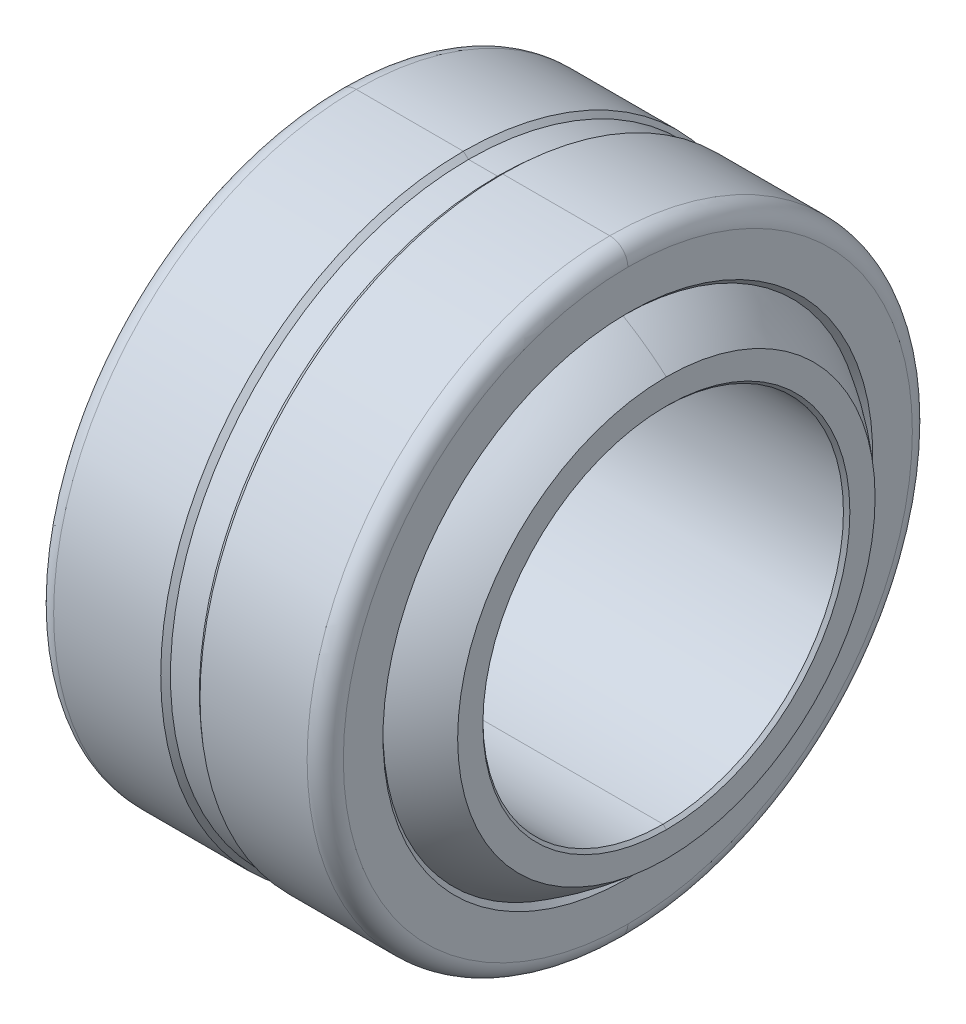
ISO-10303-21;
HEADER;
FILE_DESCRIPTION(('STEP AP214'),'2;1');
FILE_NAME('part.step','',(''),(''),'','','');
FILE_SCHEMA(('AUTOMOTIVE_DESIGN { 1 0 10303 214 1 1 1 1 }'));
ENDSEC;
DATA;
#1=APPLICATION_CONTEXT('core data for automotive mechanical design processes');
#2=APPLICATION_PROTOCOL_DEFINITION('international standard','automotive_design',2000,#1);
#3=PRODUCT_CONTEXT('',#1,'mechanical');
#4=PRODUCT('Part','Part','',(#3));
#5=PRODUCT_RELATED_PRODUCT_CATEGORY('part','',(#4));
#6=PRODUCT_DEFINITION_FORMATION('','',#4);
#7=PRODUCT_DEFINITION_CONTEXT('part definition',#1,'design');
#8=PRODUCT_DEFINITION('design','',#6,#7);
#9=PRODUCT_DEFINITION_SHAPE('','',#8);
#10=(LENGTH_UNIT() NAMED_UNIT(*) SI_UNIT(.MILLI.,.METRE.));
#11=(NAMED_UNIT(*) PLANE_ANGLE_UNIT() SI_UNIT($,.RADIAN.));
#12=(NAMED_UNIT(*) SI_UNIT($,.STERADIAN.) SOLID_ANGLE_UNIT());
#13=UNCERTAINTY_MEASURE_WITH_UNIT(LENGTH_MEASURE(1.E-05),#10,'distance_accuracy_value','');
#14=(GEOMETRIC_REPRESENTATION_CONTEXT(3) GLOBAL_UNCERTAINTY_ASSIGNED_CONTEXT((#13)) GLOBAL_UNIT_ASSIGNED_CONTEXT((#10,
#11,#12)) REPRESENTATION_CONTEXT('',''));
#15=CARTESIAN_POINT('',(0.,0.,0.));
#16=DIRECTION('',(0.,0.,1.));
#17=DIRECTION('',(1.,0.,0.));
#18=AXIS2_PLACEMENT_3D('',#15,#16,#17);
#19=CARTESIAN_POINT('',(-45.212,0.,0.));
#20=DIRECTION('',(1.,0.,0.));
#21=DIRECTION('',(0.,-1.,0.));
#22=AXIS2_PLACEMENT_3D('',#19,#20,#21);
#23=PLANE('',#22);
#24=CARTESIAN_POINT('',(-45.212,0.,0.));
#25=DIRECTION('',(-1.,0.,0.));
#26=DIRECTION('',(0.,1.,0.));
#27=AXIS2_PLACEMENT_3D('',#24,#25,#26);
#28=CIRCLE('',#27,45.2413850706692);
#29=CARTESIAN_POINT('',(-45.212,45.2413850706692,0.));
#30=VERTEX_POINT('',#29);
#31=CARTESIAN_POINT('',(-45.212,-45.2413850706692,0.));
#32=VERTEX_POINT('',#31);
#33=EDGE_CURVE('E25',#30,#32,#28,.T.);
#34=ORIENTED_EDGE('',*,*,#33,.F.);
#35=CARTESIAN_POINT('',(-45.212,0.,0.));
#36=DIRECTION('',(1.,0.,0.));
#37=DIRECTION('',(0.,1.,0.));
#38=AXIS2_PLACEMENT_3D('',#35,#36,#37);
#39=CIRCLE('',#38,45.2413850706692);
#40=EDGE_CURVE('E10',#30,#32,#39,.T.);
#41=ORIENTED_EDGE('',*,*,#40,.T.);
#42=EDGE_LOOP('',(#34,#41));
#43=FACE_BOUND('',#42,.T.);
#44=CARTESIAN_POINT('',(-45.212,0.,0.));
#45=DIRECTION('',(1.,0.,0.));
#46=DIRECTION('',(0.,1.,0.));
#47=AXIS2_PLACEMENT_3D('',#44,#45,#46);
#48=CIRCLE('',#47,51.4649946122605);
#49=CARTESIAN_POINT('',(-45.212,51.4649946122605,0.));
#50=VERTEX_POINT('',#49);
#51=CARTESIAN_POINT('',(-45.212,-51.4649946122605,0.));
#52=VERTEX_POINT('',#51);
#53=EDGE_CURVE('E19',#50,#52,#48,.T.);
#54=ORIENTED_EDGE('',*,*,#53,.F.);
#55=CARTESIAN_POINT('',(-45.212,0.,0.));
#56=DIRECTION('',(-1.,0.,0.));
#57=DIRECTION('',(0.,1.,0.));
#58=AXIS2_PLACEMENT_3D('',#55,#56,#57);
#59=CIRCLE('',#58,51.4649946122605);
#60=EDGE_CURVE('E247',#50,#52,#59,.T.);
#61=ORIENTED_EDGE('',*,*,#60,.T.);
#62=EDGE_LOOP('',(#54,#61));
#63=FACE_BOUND('',#62,.T.);
#64=ADVANCED_FACE('F16',(#43,#63),#23,.F.);
#65=CARTESIAN_POINT('',(-44.2257992607137,0.,0.));
#66=DIRECTION('',(-1.,0.,0.));
#67=DIRECTION('',(0.,1.,0.));
#68=AXIS2_PLACEMENT_3D('',#65,#66,#67);
#69=CONICAL_SURFACE('',#68,44.2551843313829,0.785398163397445);
#70=CARTESIAN_POINT('',(-44.4206149293308,0.,0.));
#71=DIRECTION('',(1.,0.,0.));
#72=DIRECTION('',(0.,1.,0.));
#73=AXIS2_PLACEMENT_3D('',#70,#71,#72);
#74=CIRCLE('',#73,44.45);
#75=CARTESIAN_POINT('',(-44.4206149293308,44.45,0.));
#76=VERTEX_POINT('',#75);
#77=CARTESIAN_POINT('',(-44.4206149293308,-44.45,0.));
#78=VERTEX_POINT('',#77);
#79=EDGE_CURVE('E225',#76,#78,#74,.T.);
#80=ORIENTED_EDGE('',*,*,#79,.T.);
#81=DIRECTION('',(0.707106781186551,0.707106781186544,0.));
#82=VECTOR('',#81,1.);
#83=CARTESIAN_POINT('',(-45.212,-45.2413850706692,0.));
#84=LINE('',#83,#82);
#85=EDGE_CURVE('E241',#32,#78,#84,.T.);
#86=ORIENTED_EDGE('',*,*,#85,.F.);
#87=ORIENTED_EDGE('',*,*,#40,.F.);
#88=DIRECTION('',(0.707106781186551,-0.707106781186544,0.));
#89=VECTOR('',#88,1.);
#90=CARTESIAN_POINT('',(-45.212,45.2413850706692,0.));
#91=LINE('',#90,#89);
#92=EDGE_CURVE('E238',#30,#76,#91,.T.);
#93=ORIENTED_EDGE('',*,*,#92,.T.);
#94=EDGE_LOOP('',(#80,#86,#87,#93));
#95=FACE_BOUND('',#94,.T.);
#96=ADVANCED_FACE('F426',(#95),#69,.F.);
#97=CARTESIAN_POINT('',(-44.2257992607137,0.,0.));
#98=DIRECTION('',(-1.,0.,0.));
#99=DIRECTION('',(0.,1.,0.));
#100=AXIS2_PLACEMENT_3D('',#97,#98,#99);
#101=CONICAL_SURFACE('',#100,44.2551843313829,0.785398163397445);
#102=ORIENTED_EDGE('',*,*,#33,.T.);
#103=ORIENTED_EDGE('',*,*,#85,.T.);
#104=CARTESIAN_POINT('',(-44.4206149293308,0.,0.));
#105=DIRECTION('',(-1.,0.,0.));
#106=DIRECTION('',(0.,1.,0.));
#107=AXIS2_PLACEMENT_3D('',#104,#105,#106);
#108=CIRCLE('',#107,44.45);
#109=EDGE_CURVE('E234',#76,#78,#108,.T.);
#110=ORIENTED_EDGE('',*,*,#109,.F.);
#111=ORIENTED_EDGE('',*,*,#92,.F.);
#112=EDGE_LOOP('',(#102,#103,#110,#111));
#113=FACE_BOUND('',#112,.T.);
#114=ADVANCED_FACE('F431',(#113),#101,.F.);
#115=CARTESIAN_POINT('',(-49.7332,0.,0.));
#116=DIRECTION('',(1.,0.,0.));
#117=DIRECTION('',(0.,-1.,0.));
#118=AXIS2_PLACEMENT_3D('',#115,#116,#117);
#119=CYLINDRICAL_SURFACE('',#118,44.45);
#120=ORIENTED_EDGE('',*,*,#109,.T.);
#121=DIRECTION('',(1.,0.,0.));
#122=VECTOR('',#121,1.);
#123=CARTESIAN_POINT('',(-44.4206149293308,-44.45,0.));
#124=LINE('',#123,#122);
#125=CARTESIAN_POINT('',(44.4206149293308,-44.45,0.));
#126=VERTEX_POINT('',#125);
#127=EDGE_CURVE('E228',#78,#126,#124,.T.);
#128=ORIENTED_EDGE('',*,*,#127,.T.);
#129=CARTESIAN_POINT('',(44.4206149293308,0.,0.));
#130=DIRECTION('',(-1.,0.,0.));
#131=DIRECTION('',(0.,1.,0.));
#132=AXIS2_PLACEMENT_3D('',#129,#130,#131);
#133=CIRCLE('',#132,44.45);
#134=CARTESIAN_POINT('',(44.4206149293308,44.45,0.));
#135=VERTEX_POINT('',#134);
#136=EDGE_CURVE('E216',#135,#126,#133,.T.);
#137=ORIENTED_EDGE('',*,*,#136,.F.);
#138=DIRECTION('',(1.,0.,0.));
#139=VECTOR('',#138,1.);
#140=CARTESIAN_POINT('',(-44.4206149293308,44.45,0.));
#141=LINE('',#140,#139);
#142=EDGE_CURVE('E224',#76,#135,#141,.T.);
#143=ORIENTED_EDGE('',*,*,#142,.F.);
#144=EDGE_LOOP('',(#120,#128,#137,#143));
#145=FACE_BOUND('',#144,.T.);
#146=ADVANCED_FACE('F667',(#145),#119,.F.);
#147=CARTESIAN_POINT('',(-49.7332,0.,0.));
#148=DIRECTION('',(1.,0.,0.));
#149=DIRECTION('',(0.,-1.,0.));
#150=AXIS2_PLACEMENT_3D('',#147,#148,#149);
#151=CYLINDRICAL_SURFACE('',#150,44.45);
#152=CARTESIAN_POINT('',(44.4206149293308,0.,0.));
#153=DIRECTION('',(1.,0.,0.));
#154=DIRECTION('',(0.,1.,0.));
#155=AXIS2_PLACEMENT_3D('',#152,#153,#154);
#156=CIRCLE('',#155,44.45);
#157=EDGE_CURVE('E220',#135,#126,#156,.T.);
#158=ORIENTED_EDGE('',*,*,#157,.T.);
#159=ORIENTED_EDGE('',*,*,#127,.F.);
#160=ORIENTED_EDGE('',*,*,#79,.F.);
#161=ORIENTED_EDGE('',*,*,#142,.T.);
#162=EDGE_LOOP('',(#158,#159,#160,#161));
#163=FACE_BOUND('',#162,.T.);
#164=ADVANCED_FACE('F658',(#163),#151,.F.);
#165=CARTESIAN_POINT('',(44.2257992607137,0.,0.));
#166=DIRECTION('',(1.,0.,0.));
#167=DIRECTION('',(0.,-1.,0.));
#168=AXIS2_PLACEMENT_3D('',#165,#166,#167);
#169=CONICAL_SURFACE('',#168,44.2551843313829,0.785398163397431);
#170=CARTESIAN_POINT('',(45.212,0.,0.));
#171=DIRECTION('',(1.,0.,0.));
#172=DIRECTION('',(0.,1.,0.));
#173=AXIS2_PLACEMENT_3D('',#170,#171,#172);
#174=CIRCLE('',#173,45.2413850706692);
#175=CARTESIAN_POINT('',(45.212,45.2413850706692,0.));
#176=VERTEX_POINT('',#175);
#177=CARTESIAN_POINT('',(45.212,-45.2413850706692,0.));
#178=VERTEX_POINT('',#177);
#179=EDGE_CURVE('E206',#176,#178,#174,.T.);
#180=ORIENTED_EDGE('',*,*,#179,.T.);
#181=DIRECTION('',(0.70710678118656,-0.707106781186535,0.));
#182=VECTOR('',#181,1.);
#183=CARTESIAN_POINT('',(44.4206149293308,-44.45,0.));
#184=LINE('',#183,#182);
#185=EDGE_CURVE('E212',#126,#178,#184,.T.);
#186=ORIENTED_EDGE('',*,*,#185,.F.);
#187=ORIENTED_EDGE('',*,*,#157,.F.);
#188=DIRECTION('',(0.70710678118656,0.707106781186535,0.));
#189=VECTOR('',#188,1.);
#190=CARTESIAN_POINT('',(44.4206149293308,44.45,0.));
#191=LINE('',#190,#189);
#192=EDGE_CURVE('E209',#135,#176,#191,.T.);
#193=ORIENTED_EDGE('',*,*,#192,.T.);
#194=EDGE_LOOP('',(#180,#186,#187,#193));
#195=FACE_BOUND('',#194,.T.);
#196=ADVANCED_FACE('F649',(#195),#169,.F.);
#197=CARTESIAN_POINT('',(44.2257992607137,0.,0.));
#198=DIRECTION('',(1.,0.,0.));
#199=DIRECTION('',(0.,-1.,0.));
#200=AXIS2_PLACEMENT_3D('',#197,#198,#199);
#201=CONICAL_SURFACE('',#200,44.2551843313829,0.785398163397431);
#202=ORIENTED_EDGE('',*,*,#136,.T.);
#203=ORIENTED_EDGE('',*,*,#185,.T.);
#204=CARTESIAN_POINT('',(45.212,0.,0.));
#205=DIRECTION('',(-1.,0.,0.));
#206=DIRECTION('',(0.,1.,0.));
#207=AXIS2_PLACEMENT_3D('',#204,#205,#206);
#208=CIRCLE('',#207,45.2413850706692);
#209=EDGE_CURVE('E200',#176,#178,#208,.T.);
#210=ORIENTED_EDGE('',*,*,#209,.F.);
#211=ORIENTED_EDGE('',*,*,#192,.F.);
#212=EDGE_LOOP('',(#202,#203,#210,#211));
#213=FACE_BOUND('',#212,.T.);
#214=ADVANCED_FACE('F640',(#213),#201,.F.);
#215=CARTESIAN_POINT('',(45.212,0.,0.));
#216=DIRECTION('',(1.,0.,0.));
#217=DIRECTION('',(0.,-1.,0.));
#218=AXIS2_PLACEMENT_3D('',#215,#216,#217);
#219=PLANE('',#218);
#220=ORIENTED_EDGE('',*,*,#179,.F.);
#221=ORIENTED_EDGE('',*,*,#209,.T.);
#222=EDGE_LOOP('',(#220,#221));
#223=FACE_BOUND('',#222,.T.);
#224=CARTESIAN_POINT('',(45.212,0.,0.));
#225=DIRECTION('',(-1.,0.,0.));
#226=DIRECTION('',(0.,1.,0.));
#227=AXIS2_PLACEMENT_3D('',#224,#225,#226);
#228=CIRCLE('',#227,51.4649946122605);
#229=CARTESIAN_POINT('',(45.212,51.4649946122605,0.));
#230=VERTEX_POINT('',#229);
#231=CARTESIAN_POINT('',(45.212,-51.4649946122605,0.));
#232=VERTEX_POINT('',#231);
#233=EDGE_CURVE('E190',#230,#232,#228,.T.);
#234=ORIENTED_EDGE('',*,*,#233,.F.);
#235=CARTESIAN_POINT('',(45.212,0.,0.));
#236=DIRECTION('',(1.,0.,0.));
#237=DIRECTION('',(0.,1.,0.));
#238=AXIS2_PLACEMENT_3D('',#235,#236,#237);
#239=CIRCLE('',#238,51.4649946122605);
#240=EDGE_CURVE('E197',#230,#232,#239,.T.);
#241=ORIENTED_EDGE('',*,*,#240,.T.);
#242=EDGE_LOOP('',(#234,#241));
#243=FACE_BOUND('',#242,.T.);
#244=ADVANCED_FACE('F632',(#223,#243),#219,.T.);
#245=CARTESIAN_POINT('',(34.3191617735336,0.,0.));
#246=DIRECTION('',(1.,0.,0.));
#247=DIRECTION('',(0.,-1.,0.));
#248=AXIS2_PLACEMENT_3D('',#245,#246,#247);
#249=CONICAL_SURFACE('',#248,58.9791310948253,0.785398163397491);
#250=DIRECTION('',(0.707106781186517,0.707106781186578,0.));
#251=VECTOR('',#250,1.);
#252=CARTESIAN_POINT('',(34.5139774421507,59.1739467634424,0.));
#253=LINE('',#252,#251);
#254=CARTESIAN_POINT('',(34.5139774421507,59.1739467634424,0.));
#255=VERTEX_POINT('',#254);
#256=CARTESIAN_POINT('',(35.7124,60.3723693212918,0.));
#257=VERTEX_POINT('',#256);
#258=EDGE_CURVE('E181',#255,#257,#253,.T.);
#259=ORIENTED_EDGE('',*,*,#258,.T.);
#260=CARTESIAN_POINT('',(35.7124,0.,0.));
#261=DIRECTION('',(1.,0.,0.));
#262=DIRECTION('',(0.,1.,0.));
#263=AXIS2_PLACEMENT_3D('',#260,#261,#262);
#264=CIRCLE('',#263,60.3723693212918);
#265=CARTESIAN_POINT('',(35.7124,-60.3723693212918,0.));
#266=VERTEX_POINT('',#265);
#267=EDGE_CURVE('E174',#257,#266,#264,.T.);
#268=ORIENTED_EDGE('',*,*,#267,.T.);
#269=DIRECTION('',(0.707106781186517,-0.707106781186578,0.));
#270=VECTOR('',#269,1.);
#271=CARTESIAN_POINT('',(34.5139774421507,-59.1739467634424,0.));
#272=LINE('',#271,#270);
#273=CARTESIAN_POINT('',(34.5139774421507,-59.1739467634424,0.));
#274=VERTEX_POINT('',#273);
#275=EDGE_CURVE('E33',#274,#266,#272,.T.);
#276=ORIENTED_EDGE('',*,*,#275,.F.);
#277=CARTESIAN_POINT('',(34.5139774421507,0.,0.));
#278=DIRECTION('',(1.,0.,0.));
#279=DIRECTION('',(0.,1.,0.));
#280=AXIS2_PLACEMENT_3D('',#277,#278,#279);
#281=CIRCLE('',#280,59.1739467634424);
#282=EDGE_CURVE('E37',#255,#274,#281,.T.);
#283=ORIENTED_EDGE('',*,*,#282,.F.);
#284=EDGE_LOOP('',(#259,#268,#276,#283));
#285=FACE_BOUND('',#284,.T.);
#286=ADVANCED_FACE('F623',(#285),#249,.F.);
#287=CARTESIAN_POINT('',(0.,0.,0.));
#288=DIRECTION('',(1.,0.,0.));
#289=DIRECTION('',(0.,-1.,0.));
#290=AXIS2_PLACEMENT_3D('',#287,#288,#289);
#291=SPHERICAL_SURFACE('',#290,68.5038);
#292=CARTESIAN_POINT('',(0.,0.,0.));
#293=DIRECTION('',(0.,0.,-1.));
#294=DIRECTION('',(0.659992584352985,-0.751272113550788,0.));
#295=AXIS2_PLACEMENT_3D('',#292,#293,#294);
#296=CIRCLE('',#295,68.5038);
#297=EDGE_CURVE('E186',#232,#274,#296,.T.);
#298=ORIENTED_EDGE('',*,*,#297,.F.);
#299=ORIENTED_EDGE('',*,*,#240,.F.);
#300=CARTESIAN_POINT('',(0.,0.,0.));
#301=DIRECTION('',(0.,0.,1.));
#302=DIRECTION('',(0.659992584352985,0.751272113550788,0.));
#303=AXIS2_PLACEMENT_3D('',#300,#301,#302);
#304=CIRCLE('',#303,68.5038);
#305=EDGE_CURVE('E194',#230,#255,#304,.T.);
#306=ORIENTED_EDGE('',*,*,#305,.T.);
#307=ORIENTED_EDGE('',*,*,#282,.T.);
#308=EDGE_LOOP('',(#298,#299,#306,#307));
#309=FACE_BOUND('',#308,.T.);
#310=ADVANCED_FACE('F614',(#309),#291,.T.);
#311=CARTESIAN_POINT('',(0.,0.,0.));
#312=DIRECTION('',(1.,0.,0.));
#313=DIRECTION('',(0.,-1.,0.));
#314=AXIS2_PLACEMENT_3D('',#311,#312,#313);
#315=SPHERICAL_SURFACE('',#314,68.5038);
#316=ORIENTED_EDGE('',*,*,#305,.F.);
#317=ORIENTED_EDGE('',*,*,#233,.T.);
#318=ORIENTED_EDGE('',*,*,#297,.T.);
#319=CARTESIAN_POINT('',(34.5139774421507,0.,0.));
#320=DIRECTION('',(1.,0.,0.));
#321=DIRECTION('',(0.,-1.,0.));
#322=AXIS2_PLACEMENT_3D('',#319,#320,#321);
#323=CIRCLE('',#322,59.1739467634424);
#324=EDGE_CURVE('E177',#274,#255,#323,.T.);
#325=ORIENTED_EDGE('',*,*,#324,.T.);
#326=EDGE_LOOP('',(#316,#317,#318,#325));
#327=FACE_BOUND('',#326,.T.);
#328=ADVANCED_FACE('F605',(#327),#315,.T.);
#329=CARTESIAN_POINT('',(34.3191617735336,0.,0.));
#330=DIRECTION('',(1.,0.,0.));
#331=DIRECTION('',(0.,-1.,0.));
#332=AXIS2_PLACEMENT_3D('',#329,#330,#331);
#333=CONICAL_SURFACE('',#332,58.9791310948253,0.785398163397491);
#334=ORIENTED_EDGE('',*,*,#275,.T.);
#335=CARTESIAN_POINT('',(35.7124,0.,0.));
#336=DIRECTION('',(-1.,0.,0.));
#337=DIRECTION('',(0.,1.,0.));
#338=AXIS2_PLACEMENT_3D('',#335,#336,#337);
#339=CIRCLE('',#338,60.3723693212918);
#340=EDGE_CURVE('E155',#257,#266,#339,.T.);
#341=ORIENTED_EDGE('',*,*,#340,.F.);
#342=ORIENTED_EDGE('',*,*,#258,.F.);
#343=ORIENTED_EDGE('',*,*,#324,.F.);
#344=EDGE_LOOP('',(#334,#341,#342,#343));
#345=FACE_BOUND('',#344,.T.);
#346=ADVANCED_FACE('F596',(#345),#333,.F.);
#347=CARTESIAN_POINT('',(35.7124,0.,0.));
#348=DIRECTION('',(1.,0.,0.));
#349=DIRECTION('',(0.,-1.,0.));
#350=AXIS2_PLACEMENT_3D('',#347,#348,#349);
#351=PLANE('',#350);
#352=ORIENTED_EDGE('',*,*,#267,.F.);
#353=ORIENTED_EDGE('',*,*,#340,.T.);
#354=EDGE_LOOP('',(#352,#353));
#355=FACE_BOUND('',#354,.T.);
#356=CARTESIAN_POINT('',(35.7124,0.,0.));
#357=DIRECTION('',(-1.,0.,0.));
#358=DIRECTION('',(0.,1.,0.));
#359=AXIS2_PLACEMENT_3D('',#356,#357,#358);
#360=CIRCLE('',#359,70.14845);
#361=CARTESIAN_POINT('',(35.7124,70.14845,0.));
#362=VERTEX_POINT('',#361);
#363=CARTESIAN_POINT('',(35.7124,-70.14845,0.));
#364=VERTEX_POINT('',#363);
#365=EDGE_CURVE('E139',#362,#364,#360,.T.);
#366=ORIENTED_EDGE('',*,*,#365,.F.);
#367=CARTESIAN_POINT('',(35.7124,0.,0.));
#368=DIRECTION('',(1.,0.,0.));
#369=DIRECTION('',(0.,1.,0.));
#370=AXIS2_PLACEMENT_3D('',#367,#368,#369);
#371=CIRCLE('',#370,70.14845);
#372=EDGE_CURVE('E142',#362,#364,#371,.T.);
#373=ORIENTED_EDGE('',*,*,#372,.T.);
#374=EDGE_LOOP('',(#366,#373));
#375=FACE_BOUND('',#374,.T.);
#376=ADVANCED_FACE('F141',(#355,#375),#351,.T.);
#377=CARTESIAN_POINT('',(31.24835,0.,0.));
#378=DIRECTION('',(1.,0.,0.));
#379=DIRECTION('',(0.,-1.,0.));
#380=AXIS2_PLACEMENT_3D('',#377,#378,#379);
#381=TOROIDAL_SURFACE('',#380,70.14845,4.46405);
#382=CARTESIAN_POINT('',(31.24835,0.,0.));
#383=DIRECTION('',(1.,0.,0.));
#384=DIRECTION('',(0.,1.,0.));
#385=AXIS2_PLACEMENT_3D('',#382,#383,#384);
#386=CIRCLE('',#385,74.6125);
#387=CARTESIAN_POINT('',(31.24835,74.6125,0.));
#388=VERTEX_POINT('',#387);
#389=CARTESIAN_POINT('',(31.24835,-74.6125,0.));
#390=VERTEX_POINT('',#389);
#391=EDGE_CURVE('E360',#388,#390,#386,.T.);
#392=ORIENTED_EDGE('',*,*,#391,.T.);
#393=CARTESIAN_POINT('',(31.24835,-70.14845,0.));
#394=DIRECTION('',(0.,0.,-1.));
#395=DIRECTION('',(1.,0.,0.));
#396=AXIS2_PLACEMENT_3D('',#393,#394,#395);
#397=CIRCLE('',#396,4.46405);
#398=EDGE_CURVE('E148',#364,#390,#397,.T.);
#399=ORIENTED_EDGE('',*,*,#398,.F.);
#400=ORIENTED_EDGE('',*,*,#372,.F.);
#401=CARTESIAN_POINT('',(31.24835,70.14845,0.));
#402=DIRECTION('',(0.,0.,1.));
#403=DIRECTION('',(1.,0.,0.));
#404=AXIS2_PLACEMENT_3D('',#401,#402,#403);
#405=CIRCLE('',#404,4.46405);
#406=EDGE_CURVE('E152',#362,#388,#405,.T.);
#407=ORIENTED_EDGE('',*,*,#406,.T.);
#408=EDGE_LOOP('',(#392,#399,#400,#407));
#409=FACE_BOUND('',#408,.T.);
#410=ADVANCED_FACE('F151',(#409),#381,.T.);
#411=CARTESIAN_POINT('',(31.24835,0.,0.));
#412=DIRECTION('',(1.,0.,0.));
#413=DIRECTION('',(0.,-1.,0.));
#414=AXIS2_PLACEMENT_3D('',#411,#412,#413);
#415=TOROIDAL_SURFACE('',#414,70.14845,4.46405);
#416=ORIENTED_EDGE('',*,*,#365,.T.);
#417=ORIENTED_EDGE('',*,*,#398,.T.);
#418=CARTESIAN_POINT('',(31.24835,0.,0.));
#419=DIRECTION('',(-1.,0.,0.));
#420=DIRECTION('',(0.,1.,0.));
#421=AXIS2_PLACEMENT_3D('',#418,#419,#420);
#422=CIRCLE('',#421,74.6125);
#423=EDGE_CURVE('E159',#388,#390,#422,.T.);
#424=ORIENTED_EDGE('',*,*,#423,.F.);
#425=ORIENTED_EDGE('',*,*,#406,.F.);
#426=EDGE_LOOP('',(#416,#417,#424,#425));
#427=FACE_BOUND('',#426,.T.);
#428=ADVANCED_FACE('F157',(#427),#415,.T.);
#429=CARTESIAN_POINT('',(-39.28364,0.,0.));
#430=DIRECTION('',(1.,0.,0.));
#431=DIRECTION('',(0.,-1.,0.));
#432=AXIS2_PLACEMENT_3D('',#429,#430,#431);
#433=CYLINDRICAL_SURFACE('',#432,74.6125);
#434=ORIENTED_EDGE('',*,*,#423,.T.);
#435=DIRECTION('',(-1.,0.,0.));
#436=VECTOR('',#435,1.);
#437=CARTESIAN_POINT('',(31.24835,-74.6125,0.));
#438=LINE('',#437,#436);
#439=CARTESIAN_POINT('',(4.84397429833891,-74.6125,0.));
#440=VERTEX_POINT('',#439);
#441=EDGE_CURVE('E167',#390,#440,#438,.T.);
#442=ORIENTED_EDGE('',*,*,#441,.T.);
#443=CARTESIAN_POINT('',(4.84397429833891,0.,0.));
#444=DIRECTION('',(-1.,0.,0.));
#445=DIRECTION('',(0.,1.,0.));
#446=AXIS2_PLACEMENT_3D('',#443,#444,#445);
#447=CIRCLE('',#446,74.6125);
#448=CARTESIAN_POINT('',(4.84397429833891,74.6125,0.));
#449=VERTEX_POINT('',#448);
#450=EDGE_CURVE('E351',#449,#440,#447,.T.);
#451=ORIENTED_EDGE('',*,*,#450,.F.);
#452=DIRECTION('',(-1.,0.,0.));
#453=VECTOR('',#452,1.);
#454=CARTESIAN_POINT('',(31.24835,74.6125,0.));
#455=LINE('',#454,#453);
#456=EDGE_CURVE('E359',#388,#449,#455,.T.);
#457=ORIENTED_EDGE('',*,*,#456,.F.);
#458=EDGE_LOOP('',(#434,#442,#451,#457));
#459=FACE_BOUND('',#458,.T.);
#460=ADVANCED_FACE('F368',(#459),#433,.T.);
#461=CARTESIAN_POINT('',(-39.28364,0.,0.));
#462=DIRECTION('',(1.,0.,0.));
#463=DIRECTION('',(0.,-1.,0.));
#464=AXIS2_PLACEMENT_3D('',#461,#462,#463);
#465=CYLINDRICAL_SURFACE('',#464,74.6125);
#466=CARTESIAN_POINT('',(4.84397429833891,0.,0.));
#467=DIRECTION('',(1.,0.,0.));
#468=DIRECTION('',(0.,1.,0.));
#469=AXIS2_PLACEMENT_3D('',#466,#467,#468);
#470=CIRCLE('',#469,74.6125);
#471=EDGE_CURVE('E355',#449,#440,#470,.T.);
#472=ORIENTED_EDGE('',*,*,#471,.T.);
#473=ORIENTED_EDGE('',*,*,#441,.F.);
#474=ORIENTED_EDGE('',*,*,#391,.F.);
#475=ORIENTED_EDGE('',*,*,#456,.T.);
#476=EDGE_LOOP('',(#472,#473,#474,#475));
#477=FACE_BOUND('',#476,.T.);
#478=ADVANCED_FACE('F373',(#477),#465,.T.);
#479=CARTESIAN_POINT('',(3.36434420879615,0.,0.));
#480=DIRECTION('',(1.,0.,0.));
#481=DIRECTION('',(0.,-1.,0.));
#482=AXIS2_PLACEMENT_3D('',#479,#480,#481);
#483=CONICAL_SURFACE('',#482,73.3113772888407,0.721292219971695);
#484=CARTESIAN_POINT('',(3.57124,0.,0.));
#485=DIRECTION('',(1.,0.,0.));
#486=DIRECTION('',(0.,1.,0.));
#487=AXIS2_PLACEMENT_3D('',#484,#485,#486);
#488=CIRCLE('',#487,73.4933125);
#489=CARTESIAN_POINT('',(3.57124,73.4933125,0.));
#490=VERTEX_POINT('',#489);
#491=CARTESIAN_POINT('',(3.57124,-73.4933125,0.));
#492=VERTEX_POINT('',#491);
#493=EDGE_CURVE('E331',#490,#492,#488,.T.);
#494=ORIENTED_EDGE('',*,*,#493,.T.);
#495=DIRECTION('',(-0.750953031641163,0.660355619548245,0.));
#496=VECTOR('',#495,1.);
#497=CARTESIAN_POINT('',(4.84397429833891,-74.6125,0.));
#498=LINE('',#497,#496);
#499=EDGE_CURVE('E347',#440,#492,#498,.T.);
#500=ORIENTED_EDGE('',*,*,#499,.F.);
#501=ORIENTED_EDGE('',*,*,#471,.F.);
#502=DIRECTION('',(-0.750953031641163,-0.660355619548245,0.));
#503=VECTOR('',#502,1.);
#504=CARTESIAN_POINT('',(4.84397429833891,74.6125,0.));
#505=LINE('',#504,#503);
#506=EDGE_CURVE('E344',#449,#490,#505,.T.);
#507=ORIENTED_EDGE('',*,*,#506,.T.);
#508=EDGE_LOOP('',(#494,#500,#501,#507));
#509=FACE_BOUND('',#508,.T.);
#510=ADVANCED_FACE('F376',(#509),#483,.T.);
#511=CARTESIAN_POINT('',(3.36434420879615,0.,0.));
#512=DIRECTION('',(1.,0.,0.));
#513=DIRECTION('',(0.,-1.,0.));
#514=AXIS2_PLACEMENT_3D('',#511,#512,#513);
#515=CONICAL_SURFACE('',#514,73.3113772888407,0.721292219971695);
#516=ORIENTED_EDGE('',*,*,#450,.T.);
#517=ORIENTED_EDGE('',*,*,#499,.T.);
#518=CARTESIAN_POINT('',(3.57124,0.,0.));
#519=DIRECTION('',(-1.,0.,0.));
#520=DIRECTION('',(0.,1.,0.));
#521=AXIS2_PLACEMENT_3D('',#518,#519,#520);
#522=CIRCLE('',#521,73.4933125);
#523=EDGE_CURVE('E340',#490,#492,#522,.T.);
#524=ORIENTED_EDGE('',*,*,#523,.F.);
#525=ORIENTED_EDGE('',*,*,#506,.F.);
#526=EDGE_LOOP('',(#516,#517,#524,#525));
#527=FACE_BOUND('',#526,.T.);
#528=ADVANCED_FACE('F380',(#527),#515,.T.);
#529=CARTESIAN_POINT('',(-39.28364,0.,0.));
#530=DIRECTION('',(1.,0.,0.));
#531=DIRECTION('',(0.,-1.,0.));
#532=AXIS2_PLACEMENT_3D('',#529,#530,#531);
#533=CYLINDRICAL_SURFACE('',#532,73.4933125);
#534=ORIENTED_EDGE('',*,*,#523,.T.);
#535=DIRECTION('',(-1.,0.,0.));
#536=VECTOR('',#535,1.);
#537=CARTESIAN_POINT('',(3.57124,-73.4933125,0.));
#538=LINE('',#537,#536);
#539=CARTESIAN_POINT('',(-3.57124,-73.4933125,0.));
#540=VERTEX_POINT('',#539);
#541=EDGE_CURVE('E334',#492,#540,#538,.T.);
#542=ORIENTED_EDGE('',*,*,#541,.T.);
#543=CARTESIAN_POINT('',(-3.57124,0.,0.));
#544=DIRECTION('',(-1.,0.,0.));
#545=DIRECTION('',(0.,1.,0.));
#546=AXIS2_PLACEMENT_3D('',#543,#544,#545);
#547=CIRCLE('',#546,73.4933125);
#548=CARTESIAN_POINT('',(-3.57124,73.4933125,0.));
#549=VERTEX_POINT('',#548);
#550=EDGE_CURVE('E322',#549,#540,#547,.T.);
#551=ORIENTED_EDGE('',*,*,#550,.F.);
#552=DIRECTION('',(-1.,0.,0.));
#553=VECTOR('',#552,1.);
#554=CARTESIAN_POINT('',(3.57124,73.4933125,0.));
#555=LINE('',#554,#553);
#556=EDGE_CURVE('E330',#490,#549,#555,.T.);
#557=ORIENTED_EDGE('',*,*,#556,.F.);
#558=EDGE_LOOP('',(#534,#542,#551,#557));
#559=FACE_BOUND('',#558,.T.);
#560=ADVANCED_FACE('F384',(#559),#533,.T.);
#561=CARTESIAN_POINT('',(-39.28364,0.,0.));
#562=DIRECTION('',(1.,0.,0.));
#563=DIRECTION('',(0.,-1.,0.));
#564=AXIS2_PLACEMENT_3D('',#561,#562,#563);
#565=CYLINDRICAL_SURFACE('',#564,73.4933125);
#566=CARTESIAN_POINT('',(-3.57124,0.,0.));
#567=DIRECTION('',(1.,0.,0.));
#568=DIRECTION('',(0.,1.,0.));
#569=AXIS2_PLACEMENT_3D('',#566,#567,#568);
#570=CIRCLE('',#569,73.4933125);
#571=EDGE_CURVE('E326',#549,#540,#570,.T.);
#572=ORIENTED_EDGE('',*,*,#571,.T.);
#573=ORIENTED_EDGE('',*,*,#541,.F.);
#574=ORIENTED_EDGE('',*,*,#493,.F.);
#575=ORIENTED_EDGE('',*,*,#556,.T.);
#576=EDGE_LOOP('',(#572,#573,#574,#575));
#577=FACE_BOUND('',#576,.T.);
#578=ADVANCED_FACE('F387',(#577),#565,.T.);
#579=CARTESIAN_POINT('',(-3.36434420879615,0.,0.));
#580=DIRECTION('',(-1.,0.,0.));
#581=DIRECTION('',(0.,1.,0.));
#582=AXIS2_PLACEMENT_3D('',#579,#580,#581);
#583=CONICAL_SURFACE('',#582,73.3113772888407,0.721292219971695);
#584=CARTESIAN_POINT('',(-4.8439742983389,0.,0.));
#585=DIRECTION('',(1.,0.,0.));
#586=DIRECTION('',(0.,1.,0.));
#587=AXIS2_PLACEMENT_3D('',#584,#585,#586);
#588=CIRCLE('',#587,74.6125);
#589=CARTESIAN_POINT('',(-4.84397429833891,74.6125,0.));
#590=VERTEX_POINT('',#589);
#591=CARTESIAN_POINT('',(-4.84397429833891,-74.6125,0.));
#592=VERTEX_POINT('',#591);
#593=EDGE_CURVE('E302',#590,#592,#588,.T.);
#594=ORIENTED_EDGE('',*,*,#593,.T.);
#595=DIRECTION('',(-0.750953031641163,-0.660355619548245,0.));
#596=VECTOR('',#595,1.);
#597=CARTESIAN_POINT('',(-3.57124,-73.4933125,0.));
#598=LINE('',#597,#596);
#599=EDGE_CURVE('E318',#540,#592,#598,.T.);
#600=ORIENTED_EDGE('',*,*,#599,.F.);
#601=ORIENTED_EDGE('',*,*,#571,.F.);
#602=DIRECTION('',(-0.750953031641163,0.660355619548245,0.));
#603=VECTOR('',#602,1.);
#604=CARTESIAN_POINT('',(-3.57124,73.4933125,0.));
#605=LINE('',#604,#603);
#606=EDGE_CURVE('E315',#549,#590,#605,.T.);
#607=ORIENTED_EDGE('',*,*,#606,.T.);
#608=EDGE_LOOP('',(#594,#600,#601,#607));
#609=FACE_BOUND('',#608,.T.);
#610=ADVANCED_FACE('F391',(#609),#583,.T.);
#611=CARTESIAN_POINT('',(-3.36434420879615,0.,0.));
#612=DIRECTION('',(-1.,0.,0.));
#613=DIRECTION('',(0.,1.,0.));
#614=AXIS2_PLACEMENT_3D('',#611,#612,#613);
#615=CONICAL_SURFACE('',#614,73.3113772888407,0.721292219971695);
#616=ORIENTED_EDGE('',*,*,#550,.T.);
#617=ORIENTED_EDGE('',*,*,#599,.T.);
#618=CARTESIAN_POINT('',(-4.8439742983389,0.,0.));
#619=DIRECTION('',(-1.,0.,0.));
#620=DIRECTION('',(0.,1.,0.));
#621=AXIS2_PLACEMENT_3D('',#618,#619,#620);
#622=CIRCLE('',#621,74.6125);
#623=EDGE_CURVE('E311',#590,#592,#622,.T.);
#624=ORIENTED_EDGE('',*,*,#623,.F.);
#625=ORIENTED_EDGE('',*,*,#606,.F.);
#626=EDGE_LOOP('',(#616,#617,#624,#625));
#627=FACE_BOUND('',#626,.T.);
#628=ADVANCED_FACE('F395',(#627),#615,.T.);
#629=CARTESIAN_POINT('',(-39.28364,0.,0.));
#630=DIRECTION('',(1.,0.,0.));
#631=DIRECTION('',(0.,-1.,0.));
#632=AXIS2_PLACEMENT_3D('',#629,#630,#631);
#633=CYLINDRICAL_SURFACE('',#632,74.6125);
#634=ORIENTED_EDGE('',*,*,#623,.T.);
#635=DIRECTION('',(-1.,0.,0.));
#636=VECTOR('',#635,1.);
#637=CARTESIAN_POINT('',(-4.84397429833892,-74.6125,0.));
#638=LINE('',#637,#636);
#639=CARTESIAN_POINT('',(-31.24835,-74.6125,0.));
#640=VERTEX_POINT('',#639);
#641=EDGE_CURVE('E305',#592,#640,#638,.T.);
#642=ORIENTED_EDGE('',*,*,#641,.T.);
#643=CARTESIAN_POINT('',(-31.24835,0.,0.));
#644=DIRECTION('',(-1.,0.,0.));
#645=DIRECTION('',(0.,1.,0.));
#646=AXIS2_PLACEMENT_3D('',#643,#644,#645);
#647=CIRCLE('',#646,74.6125);
#648=CARTESIAN_POINT('',(-31.24835,74.6125,0.));
#649=VERTEX_POINT('',#648);
#650=EDGE_CURVE('E293',#649,#640,#647,.T.);
#651=ORIENTED_EDGE('',*,*,#650,.F.);
#652=DIRECTION('',(-1.,0.,0.));
#653=VECTOR('',#652,1.);
#654=CARTESIAN_POINT('',(-4.84397429833892,74.6125,0.));
#655=LINE('',#654,#653);
#656=EDGE_CURVE('E301',#590,#649,#655,.T.);
#657=ORIENTED_EDGE('',*,*,#656,.F.);
#658=EDGE_LOOP('',(#634,#642,#651,#657));
#659=FACE_BOUND('',#658,.T.);
#660=ADVANCED_FACE('F399',(#659),#633,.T.);
#661=CARTESIAN_POINT('',(-39.28364,0.,0.));
#662=DIRECTION('',(1.,0.,0.));
#663=DIRECTION('',(0.,-1.,0.));
#664=AXIS2_PLACEMENT_3D('',#661,#662,#663);
#665=CYLINDRICAL_SURFACE('',#664,74.6125);
#666=CARTESIAN_POINT('',(-31.24835,0.,0.));
#667=DIRECTION('',(1.,0.,0.));
#668=DIRECTION('',(0.,1.,0.));
#669=AXIS2_PLACEMENT_3D('',#666,#667,#668);
#670=CIRCLE('',#669,74.6125);
#671=EDGE_CURVE('E297',#649,#640,#670,.T.);
#672=ORIENTED_EDGE('',*,*,#671,.T.);
#673=ORIENTED_EDGE('',*,*,#641,.F.);
#674=ORIENTED_EDGE('',*,*,#593,.F.);
#675=ORIENTED_EDGE('',*,*,#656,.T.);
#676=EDGE_LOOP('',(#672,#673,#674,#675));
#677=FACE_BOUND('',#676,.T.);
#678=ADVANCED_FACE('F402',(#677),#665,.T.);
#679=CARTESIAN_POINT('',(-31.24835,0.,0.));
#680=DIRECTION('',(1.,0.,0.));
#681=DIRECTION('',(0.,-1.,0.));
#682=AXIS2_PLACEMENT_3D('',#679,#680,#681);
#683=TOROIDAL_SURFACE('',#682,70.14845,4.46405);
#684=CARTESIAN_POINT('',(-35.7124,0.,0.));
#685=DIRECTION('',(1.,0.,0.));
#686=DIRECTION('',(0.,1.,0.));
#687=AXIS2_PLACEMENT_3D('',#684,#685,#686);
#688=CIRCLE('',#687,70.14845);
#689=CARTESIAN_POINT('',(-35.7124,70.14845,0.));
#690=VERTEX_POINT('',#689);
#691=CARTESIAN_POINT('',(-35.7124,-70.14845,0.));
#692=VERTEX_POINT('',#691);
#693=EDGE_CURVE('E283',#690,#692,#688,.T.);
#694=ORIENTED_EDGE('',*,*,#693,.T.);
#695=CARTESIAN_POINT('',(-31.24835,-70.14845,0.));
#696=DIRECTION('',(0.,0.,-1.));
#697=DIRECTION('',(0.,-1.,0.));
#698=AXIS2_PLACEMENT_3D('',#695,#696,#697);
#699=CIRCLE('',#698,4.46405);
#700=EDGE_CURVE('E289',#640,#692,#699,.T.);
#701=ORIENTED_EDGE('',*,*,#700,.F.);
#702=ORIENTED_EDGE('',*,*,#671,.F.);
#703=CARTESIAN_POINT('',(-31.24835,70.14845,0.));
#704=DIRECTION('',(0.,0.,1.));
#705=DIRECTION('',(0.,1.,0.));
#706=AXIS2_PLACEMENT_3D('',#703,#704,#705);
#707=CIRCLE('',#706,4.46405);
#708=EDGE_CURVE('E286',#649,#690,#707,.T.);
#709=ORIENTED_EDGE('',*,*,#708,.T.);
#710=EDGE_LOOP('',(#694,#701,#702,#709));
#711=FACE_BOUND('',#710,.T.);
#712=ADVANCED_FACE('F406',(#711),#683,.T.);
#713=CARTESIAN_POINT('',(-31.24835,0.,0.));
#714=DIRECTION('',(1.,0.,0.));
#715=DIRECTION('',(0.,-1.,0.));
#716=AXIS2_PLACEMENT_3D('',#713,#714,#715);
#717=TOROIDAL_SURFACE('',#716,70.14845,4.46405);
#718=ORIENTED_EDGE('',*,*,#650,.T.);
#719=ORIENTED_EDGE('',*,*,#700,.T.);
#720=CARTESIAN_POINT('',(-35.7124,0.,0.));
#721=DIRECTION('',(-1.,0.,0.));
#722=DIRECTION('',(0.,1.,0.));
#723=AXIS2_PLACEMENT_3D('',#720,#721,#722);
#724=CIRCLE('',#723,70.14845);
#725=EDGE_CURVE('E257',#690,#692,#724,.T.);
#726=ORIENTED_EDGE('',*,*,#725,.F.);
#727=ORIENTED_EDGE('',*,*,#708,.F.);
#728=EDGE_LOOP('',(#718,#719,#726,#727));
#729=FACE_BOUND('',#728,.T.);
#730=ADVANCED_FACE('F410',(#729),#717,.T.);
#731=CARTESIAN_POINT('',(-35.7124,0.,0.));
#732=DIRECTION('',(1.,0.,0.));
#733=DIRECTION('',(0.,-1.,0.));
#734=AXIS2_PLACEMENT_3D('',#731,#732,#733);
#735=PLANE('',#734);
#736=CARTESIAN_POINT('',(-35.7124,0.,0.));
#737=DIRECTION('',(-1.,0.,0.));
#738=DIRECTION('',(0.,1.,0.));
#739=AXIS2_PLACEMENT_3D('',#736,#737,#738);
#740=CIRCLE('',#739,60.3723693212918);
#741=CARTESIAN_POINT('',(-35.7124,60.3723693212918,0.));
#742=VERTEX_POINT('',#741);
#743=CARTESIAN_POINT('',(-35.7124,-60.3723693212918,0.));
#744=VERTEX_POINT('',#743);
#745=EDGE_CURVE('E249',#742,#744,#740,.T.);
#746=ORIENTED_EDGE('',*,*,#745,.F.);
#747=CARTESIAN_POINT('',(-35.7124,0.,0.));
#748=DIRECTION('',(1.,0.,0.));
#749=DIRECTION('',(0.,1.,0.));
#750=AXIS2_PLACEMENT_3D('',#747,#748,#749);
#751=CIRCLE('',#750,60.3723693212918);
#752=EDGE_CURVE('E273',#742,#744,#751,.T.);
#753=ORIENTED_EDGE('',*,*,#752,.T.);
#754=EDGE_LOOP('',(#746,#753));
#755=FACE_BOUND('',#754,.T.);
#756=ORIENTED_EDGE('',*,*,#693,.F.);
#757=ORIENTED_EDGE('',*,*,#725,.T.);
#758=EDGE_LOOP('',(#756,#757));
#759=FACE_BOUND('',#758,.T.);
#760=ADVANCED_FACE('F412',(#755,#759),#735,.F.);
#761=CARTESIAN_POINT('',(-34.3191617735335,0.,0.));
#762=DIRECTION('',(-1.,0.,0.));
#763=DIRECTION('',(0.,1.,0.));
#764=AXIS2_PLACEMENT_3D('',#761,#762,#763);
#765=CONICAL_SURFACE('',#764,58.9791310948253,0.785398163397453);
#766=DIRECTION('',(0.707106781186543,-0.707106781186552,0.));
#767=VECTOR('',#766,1.);
#768=CARTESIAN_POINT('',(-35.7124,60.3723693212918,0.));
#769=LINE('',#768,#767);
#770=CARTESIAN_POINT('',(-34.5139774421506,59.1739467634424,0.));
#771=VERTEX_POINT('',#770);
#772=EDGE_CURVE('E275',#742,#771,#769,.T.);
#773=ORIENTED_EDGE('',*,*,#772,.F.);
#774=ORIENTED_EDGE('',*,*,#745,.T.);
#775=DIRECTION('',(0.707106781186543,0.707106781186552,0.));
#776=VECTOR('',#775,1.);
#777=CARTESIAN_POINT('',(-35.7124,-60.3723693212918,0.));
#778=LINE('',#777,#776);
#779=CARTESIAN_POINT('',(-34.5139774421506,-59.1739467634424,0.));
#780=VERTEX_POINT('',#779);
#781=EDGE_CURVE('E271',#744,#780,#778,.T.);
#782=ORIENTED_EDGE('',*,*,#781,.T.);
#783=CARTESIAN_POINT('',(-34.5139774421506,0.,0.));
#784=DIRECTION('',(1.,0.,0.));
#785=DIRECTION('',(0.,-1.,0.));
#786=AXIS2_PLACEMENT_3D('',#783,#784,#785);
#787=CIRCLE('',#786,59.1739467634424);
#788=EDGE_CURVE('E250',#780,#771,#787,.T.);
#789=ORIENTED_EDGE('',*,*,#788,.T.);
#790=EDGE_LOOP('',(#773,#774,#782,#789));
#791=FACE_BOUND('',#790,.T.);
#792=ADVANCED_FACE('F414',(#791),#765,.F.);
#793=CARTESIAN_POINT('',(0.,0.,0.));
#794=DIRECTION('',(1.,0.,0.));
#795=DIRECTION('',(0.,-1.,0.));
#796=AXIS2_PLACEMENT_3D('',#793,#794,#795);
#797=SPHERICAL_SURFACE('',#796,68.5038);
#798=CARTESIAN_POINT('',(0.,0.,0.));
#799=DIRECTION('',(0.,0.,-1.));
#800=DIRECTION('',(-0.503825735829992,-0.863805318295371,0.));
#801=AXIS2_PLACEMENT_3D('',#798,#799,#800);
#802=CIRCLE('',#801,68.5038);
#803=EDGE_CURVE('E270',#780,#52,#802,.T.);
#804=ORIENTED_EDGE('',*,*,#803,.T.);
#805=ORIENTED_EDGE('',*,*,#60,.F.);
#806=CARTESIAN_POINT('',(0.,0.,0.));
#807=DIRECTION('',(0.,0.,1.));
#808=DIRECTION('',(-0.503825735829992,0.863805318295371,0.));
#809=AXIS2_PLACEMENT_3D('',#806,#807,#808);
#810=CIRCLE('',#809,68.5038);
#811=EDGE_CURVE('E259',#771,#50,#810,.T.);
#812=ORIENTED_EDGE('',*,*,#811,.F.);
#813=ORIENTED_EDGE('',*,*,#788,.F.);
#814=EDGE_LOOP('',(#804,#805,#812,#813));
#815=FACE_BOUND('',#814,.T.);
#816=ADVANCED_FACE('F422',(#815),#797,.T.);
#817=CARTESIAN_POINT('',(0.,0.,0.));
#818=DIRECTION('',(1.,0.,0.));
#819=DIRECTION('',(0.,-1.,0.));
#820=AXIS2_PLACEMENT_3D('',#817,#818,#819);
#821=SPHERICAL_SURFACE('',#820,68.5038);
#822=ORIENTED_EDGE('',*,*,#811,.T.);
#823=ORIENTED_EDGE('',*,*,#53,.T.);
#824=ORIENTED_EDGE('',*,*,#803,.F.);
#825=CARTESIAN_POINT('',(-34.5139774421506,0.,0.));
#826=DIRECTION('',(1.,0.,0.));
#827=DIRECTION('',(0.,1.,0.));
#828=AXIS2_PLACEMENT_3D('',#825,#826,#827);
#829=CIRCLE('',#828,59.1739467634424);
#830=EDGE_CURVE('E279',#771,#780,#829,.T.);
#831=ORIENTED_EDGE('',*,*,#830,.F.);
#832=EDGE_LOOP('',(#822,#823,#824,#831));
#833=FACE_BOUND('',#832,.T.);
#834=ADVANCED_FACE('F440',(#833),#821,.T.);
#835=CARTESIAN_POINT('',(-34.3191617735335,0.,0.));
#836=DIRECTION('',(-1.,0.,0.));
#837=DIRECTION('',(0.,1.,0.));
#838=AXIS2_PLACEMENT_3D('',#835,#836,#837);
#839=CONICAL_SURFACE('',#838,58.9791310948253,0.785398163397453);
#840=ORIENTED_EDGE('',*,*,#781,.F.);
#841=ORIENTED_EDGE('',*,*,#752,.F.);
#842=ORIENTED_EDGE('',*,*,#772,.T.);
#843=ORIENTED_EDGE('',*,*,#830,.T.);
#844=EDGE_LOOP('',(#840,#841,#842,#843));
#845=FACE_BOUND('',#844,.T.);
#846=ADVANCED_FACE('F447',(#845),#839,.F.);
#847=CLOSED_SHELL('',(#64,#96,#114,#146,#164,#196,#214,#244,#286,#310,#328,#346,#376,#410,#428,
#460,#478,#510,#528,#560,#578,#610,#628,#660,#678,#712,#730,#760,#792,#816,#834,#846));
#848=MANIFOLD_SOLID_BREP('B1',#847);
#849=ADVANCED_BREP_SHAPE_REPRESENTATION('',(#18,#848),#14);
#850=SHAPE_DEFINITION_REPRESENTATION(#9,#849);
ENDSEC;
END-ISO-10303-21;
